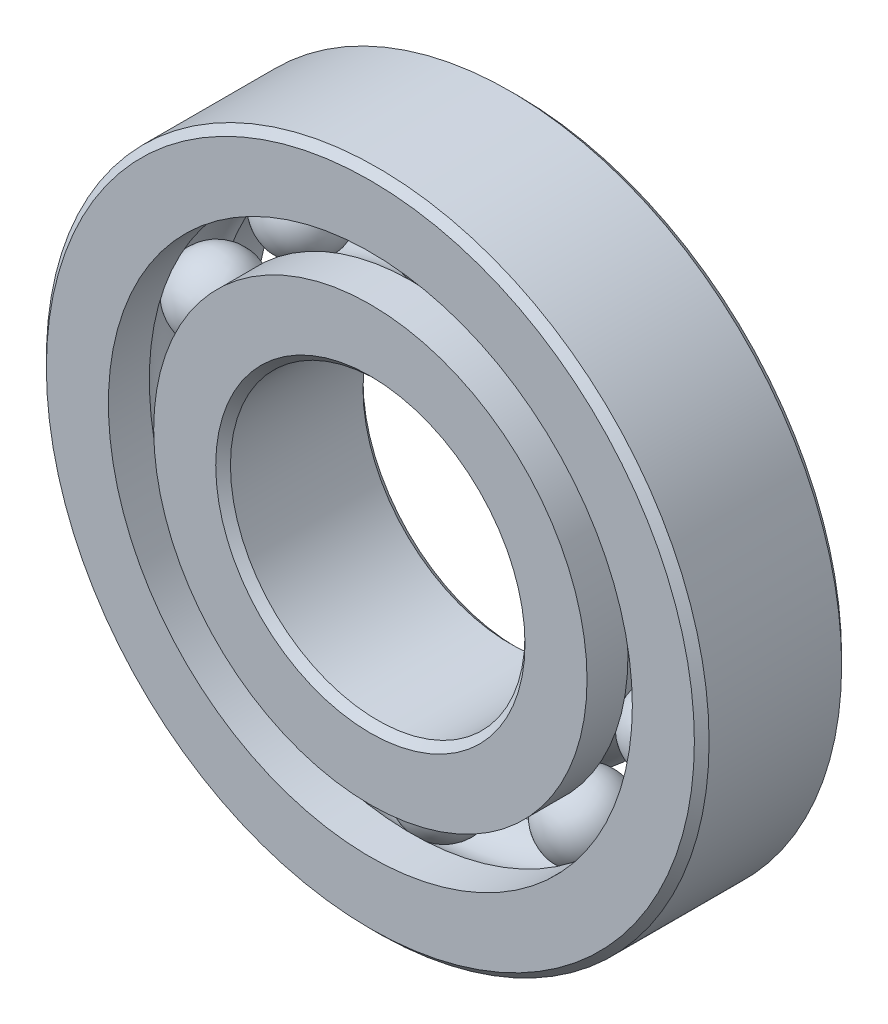
ISO-10303-21;
HEADER;
FILE_DESCRIPTION(('STEP AP214'),'2;1');
FILE_NAME('part.step','',(''),(''),'','','');
FILE_SCHEMA(('AUTOMOTIVE_DESIGN { 1 0 10303 214 1 1 1 1 }'));
ENDSEC;
DATA;
#1=APPLICATION_CONTEXT('core data for automotive mechanical design processes');
#2=APPLICATION_PROTOCOL_DEFINITION('international standard','automotive_design',2000,#1);
#3=PRODUCT_CONTEXT('',#1,'mechanical');
#4=PRODUCT('Part','Part','',(#3));
#5=PRODUCT_RELATED_PRODUCT_CATEGORY('part','',(#4));
#6=PRODUCT_DEFINITION_FORMATION('','',#4);
#7=PRODUCT_DEFINITION_CONTEXT('part definition',#1,'design');
#8=PRODUCT_DEFINITION('design','',#6,#7);
#9=PRODUCT_DEFINITION_SHAPE('','',#8);
#10=(LENGTH_UNIT() NAMED_UNIT(*) SI_UNIT(.MILLI.,.METRE.));
#11=(NAMED_UNIT(*) PLANE_ANGLE_UNIT() SI_UNIT($,.RADIAN.));
#12=(NAMED_UNIT(*) SI_UNIT($,.STERADIAN.) SOLID_ANGLE_UNIT());
#13=UNCERTAINTY_MEASURE_WITH_UNIT(LENGTH_MEASURE(1.E-05),#10,'distance_accuracy_value','');
#14=(GEOMETRIC_REPRESENTATION_CONTEXT(3) GLOBAL_UNCERTAINTY_ASSIGNED_CONTEXT((#13)) GLOBAL_UNIT_ASSIGNED_CONTEXT((#10,
#11,#12)) REPRESENTATION_CONTEXT('',''));
#15=CARTESIAN_POINT('',(0.,0.,0.));
#16=DIRECTION('',(0.,0.,1.));
#17=DIRECTION('',(1.,0.,0.));
#18=AXIS2_PLACEMENT_3D('',#15,#16,#17);
#19=CARTESIAN_POINT('',(-6.06520907209285,8.34804411070657,0.));
#20=DIRECTION('',(0.,0.,1.));
#21=DIRECTION('',(-0.587785252292462,0.809016994374955,0.));
#22=AXIS2_PLACEMENT_3D('',#19,#20,#21);
#23=SPHERICAL_SURFACE('',#22,1.71627890103156);
#24=CARTESIAN_POINT('',(-6.06520907209285,8.34804411070657,1.71627890103156));
#25=VERTEX_POINT('',#24);
#26=VERTEX_LOOP('',#25);
#27=FACE_BOUND('',#26,.T.);
#28=ADVANCED_FACE('F39',(#27),#23,.T.);
#29=CLOSED_SHELL('',(#28));
#30=MANIFOLD_SOLID_BREP('B2',#29);
#31=CARTESIAN_POINT('',(-9.81371442752058,3.1886691107066,0.));
#32=DIRECTION('',(0.,0.,1.));
#33=DIRECTION('',(-0.95105651629515,0.309016994374958,0.));
#34=AXIS2_PLACEMENT_3D('',#31,#32,#33);
#35=SPHERICAL_SURFACE('',#34,1.71627890103156);
#36=CARTESIAN_POINT('',(-9.81371442752058,3.1886691107066,1.71627890103156));
#37=VERTEX_POINT('',#36);
#38=VERTEX_LOOP('',#37);
#39=FACE_BOUND('',#38,.T.);
#40=ADVANCED_FACE('F59',(#39),#35,.T.);
#41=CLOSED_SHELL('',(#40));
#42=MANIFOLD_SOLID_BREP('B6',#41);
#43=CARTESIAN_POINT('',(-9.81371442752065,-3.18866911070639,0.));
#44=DIRECTION('',(0.,0.,1.));
#45=DIRECTION('',(-0.951056516295157,-0.309016994374938,0.));
#46=AXIS2_PLACEMENT_3D('',#43,#44,#45);
#47=SPHERICAL_SURFACE('',#46,1.71627890103156);
#48=CARTESIAN_POINT('',(-9.81371442752065,-3.18866911070639,1.71627890103156));
#49=VERTEX_POINT('',#48);
#50=VERTEX_LOOP('',#49);
#51=FACE_BOUND('',#50,.T.);
#52=ADVANCED_FACE('F79',(#51),#47,.T.);
#53=CLOSED_SHELL('',(#52));
#54=MANIFOLD_SOLID_BREP('B35',#53);
#55=CARTESIAN_POINT('',(-6.06520907209303,-8.34804411070643,0.));
#56=DIRECTION('',(0.,0.,1.));
#57=DIRECTION('',(-0.58778525229248,-0.809016994374942,0.));
#58=AXIS2_PLACEMENT_3D('',#55,#56,#57);
#59=SPHERICAL_SURFACE('',#58,1.71627890103156);
#60=CARTESIAN_POINT('',(-6.06520907209303,-8.34804411070643,1.71627890103156));
#61=VERTEX_POINT('',#60);
#62=VERTEX_LOOP('',#61);
#63=FACE_BOUND('',#62,.T.);
#64=ADVANCED_FACE('F99',(#63),#59,.T.);
#65=CLOSED_SHELL('',(#64));
#66=MANIFOLD_SOLID_BREP('B55',#65);
#67=CARTESIAN_POINT('',(0.,-10.31875,0.));
#68=DIRECTION('',(0.,0.,1.));
#69=DIRECTION('',(0.,-1.,0.));
#70=AXIS2_PLACEMENT_3D('',#67,#68,#69);
#71=SPHERICAL_SURFACE('',#70,1.71627890103156);
#72=CARTESIAN_POINT('',(0.,-10.31875,1.71627890103156));
#73=VERTEX_POINT('',#72);
#74=VERTEX_LOOP('',#73);
#75=FACE_BOUND('',#74,.T.);
#76=ADVANCED_FACE('F119',(#75),#71,.T.);
#77=CLOSED_SHELL('',(#76));
#78=MANIFOLD_SOLID_BREP('B75',#77);
#79=CARTESIAN_POINT('',(6.06520907209291,-8.34804411070652,0.));
#80=DIRECTION('',(0.,0.,1.));
#81=DIRECTION('',(0.587785252292469,-0.809016994374951,0.));
#82=AXIS2_PLACEMENT_3D('',#79,#80,#81);
#83=SPHERICAL_SURFACE('',#82,1.71627890103156);
#84=CARTESIAN_POINT('',(6.06520907209291,-8.34804411070652,1.71627890103156));
#85=VERTEX_POINT('',#84);
#86=VERTEX_LOOP('',#85);
#87=FACE_BOUND('',#86,.T.);
#88=ADVANCED_FACE('F139',(#87),#83,.T.);
#89=CLOSED_SHELL('',(#88));
#90=MANIFOLD_SOLID_BREP('B95',#89);
#91=CARTESIAN_POINT('',(9.8137144275206,-3.18866911070653,0.));
#92=DIRECTION('',(0.,0.,1.));
#93=DIRECTION('',(0.951056516295152,-0.309016994374952,0.));
#94=AXIS2_PLACEMENT_3D('',#91,#92,#93);
#95=SPHERICAL_SURFACE('',#94,1.71627890103156);
#96=CARTESIAN_POINT('',(9.8137144275206,-3.18866911070653,1.71627890103156));
#97=VERTEX_POINT('',#96);
#98=VERTEX_LOOP('',#97);
#99=FACE_BOUND('',#98,.T.);
#100=ADVANCED_FACE('F159',(#99),#95,.T.);
#101=CLOSED_SHELL('',(#100));
#102=MANIFOLD_SOLID_BREP('B115',#101);
#103=CARTESIAN_POINT('',(9.81371442752063,3.18866911070646,0.));
#104=DIRECTION('',(0.,0.,1.));
#105=DIRECTION('',(0.951056516295155,0.309016994374945,0.));
#106=AXIS2_PLACEMENT_3D('',#103,#104,#105);
#107=SPHERICAL_SURFACE('',#106,1.71627890103156);
#108=CARTESIAN_POINT('',(9.81371442752063,3.18866911070646,1.71627890103156));
#109=VERTEX_POINT('',#108);
#110=VERTEX_LOOP('',#109);
#111=FACE_BOUND('',#110,.T.);
#112=ADVANCED_FACE('F179',(#111),#107,.T.);
#113=CLOSED_SHELL('',(#112));
#114=MANIFOLD_SOLID_BREP('B135',#113);
#115=CARTESIAN_POINT('',(6.06520907209297,8.34804411070648,0.));
#116=DIRECTION('',(0.,0.,1.));
#117=DIRECTION('',(0.587785252292474,0.809016994374947,0.));
#118=AXIS2_PLACEMENT_3D('',#115,#116,#117);
#119=SPHERICAL_SURFACE('',#118,1.71627890103156);
#120=CARTESIAN_POINT('',(6.06520907209297,8.34804411070648,1.71627890103156));
#121=VERTEX_POINT('',#120);
#122=VERTEX_LOOP('',#121);
#123=FACE_BOUND('',#122,.T.);
#124=ADVANCED_FACE('F199',(#123),#119,.T.);
#125=CLOSED_SHELL('',(#124));
#126=MANIFOLD_SOLID_BREP('B155',#125);
#127=CARTESIAN_POINT('',(0.,10.31875,0.));
#128=DIRECTION('',(0.,0.,1.));
#129=DIRECTION('',(0.,1.,0.));
#130=AXIS2_PLACEMENT_3D('',#127,#128,#129);
#131=SPHERICAL_SURFACE('',#130,1.71627890103156);
#132=CARTESIAN_POINT('',(0.,10.31875,1.71627890103156));
#133=VERTEX_POINT('',#132);
#134=VERTEX_LOOP('',#133);
#135=FACE_BOUND('',#134,.T.);
#136=ADVANCED_FACE('F221',(#135),#131,.T.);
#137=CLOSED_SHELL('',(#136));
#138=MANIFOLD_SOLID_BREP('B175',#137);
#139=CARTESIAN_POINT('',(0.,9.34182692307692,3.175));
#140=DIRECTION('',(0.,0.,-1.));
#141=DIRECTION('',(-1.,0.,0.));
#142=AXIS2_PLACEMENT_3D('',#139,#140,#141);
#143=PLANE('',#142);
#144=CARTESIAN_POINT('',(0.,0.,3.175));
#145=DIRECTION('',(0.,0.,1.));
#146=DIRECTION('',(1.,0.,0.));
#147=AXIS2_PLACEMENT_3D('',#144,#145,#146);
#148=CIRCLE('',#147,6.6675);
#149=CARTESIAN_POINT('',(6.6675,0.,3.175));
#150=VERTEX_POINT('',#149);
#151=EDGE_CURVE('E268',#150,#150,#148,.T.);
#152=ORIENTED_EDGE('',*,*,#151,.F.);
#153=EDGE_LOOP('',(#152));
#154=FACE_BOUND('',#153,.T.);
#155=CARTESIAN_POINT('',(0.,0.,3.175));
#156=DIRECTION('',(0.,0.,1.));
#157=DIRECTION('',(1.,0.,0.));
#158=AXIS2_PLACEMENT_3D('',#155,#156,#157);
#159=CIRCLE('',#158,9.34182692307692);
#160=CARTESIAN_POINT('',(9.34182692307692,0.,3.175));
#161=VERTEX_POINT('',#160);
#162=EDGE_CURVE('E220',#161,#161,#159,.T.);
#163=ORIENTED_EDGE('',*,*,#162,.T.);
#164=EDGE_LOOP('',(#163));
#165=FACE_BOUND('',#164,.T.);
#166=ADVANCED_FACE('F240',(#154,#165),#143,.F.);
#167=CARTESIAN_POINT('',(0.,0.,3.175));
#168=DIRECTION('',(0.,0.,1.));
#169=DIRECTION('',(1.,0.,0.));
#170=AXIS2_PLACEMENT_3D('',#167,#168,#169);
#171=CYLINDRICAL_SURFACE('',#170,9.34182692307692);
#172=ORIENTED_EDGE('',*,*,#162,.F.);
#173=EDGE_LOOP('',(#172));
#174=FACE_BOUND('',#173,.T.);
#175=CARTESIAN_POINT('',(0.,0.,1.41111111111111));
#176=DIRECTION('',(0.,0.,1.));
#177=DIRECTION('',(1.,0.,0.));
#178=AXIS2_PLACEMENT_3D('',#175,#176,#177);
#179=CIRCLE('',#178,9.34182692307692);
#180=CARTESIAN_POINT('',(9.34182692307692,0.,1.41111111111111));
#181=VERTEX_POINT('',#180);
#182=EDGE_CURVE('E246',#181,#181,#179,.T.);
#183=ORIENTED_EDGE('',*,*,#182,.T.);
#184=EDGE_LOOP('',(#183));
#185=FACE_BOUND('',#184,.T.);
#186=ADVANCED_FACE('F275',(#174,#185),#171,.T.);
#187=CARTESIAN_POINT('',(0.,0.,0.));
#188=DIRECTION('',(0.,0.,1.));
#189=DIRECTION('',(1.,0.,0.));
#190=AXIS2_PLACEMENT_3D('',#187,#188,#189);
#191=TOROIDAL_SURFACE('',#190,10.31875,1.71627890103155);
#192=ORIENTED_EDGE('',*,*,#182,.F.);
#193=EDGE_LOOP('',(#192));
#194=FACE_BOUND('',#193,.T.);
#195=CARTESIAN_POINT('',(0.,0.,-1.41111111111111));
#196=DIRECTION('',(0.,0.,1.));
#197=DIRECTION('',(1.,0.,0.));
#198=AXIS2_PLACEMENT_3D('',#195,#196,#197);
#199=CIRCLE('',#198,9.34182692307692);
#200=CARTESIAN_POINT('',(9.34182692307692,0.,-1.41111111111111));
#201=VERTEX_POINT('',#200);
#202=EDGE_CURVE('E250',#201,#201,#199,.T.);
#203=ORIENTED_EDGE('',*,*,#202,.T.);
#204=EDGE_LOOP('',(#203));
#205=FACE_BOUND('',#204,.T.);
#206=ADVANCED_FACE('F279',(#194,#205),#191,.F.);
#207=CARTESIAN_POINT('',(0.,0.,3.175));
#208=DIRECTION('',(0.,0.,1.));
#209=DIRECTION('',(1.,0.,0.));
#210=AXIS2_PLACEMENT_3D('',#207,#208,#209);
#211=CYLINDRICAL_SURFACE('',#210,9.34182692307692);
#212=ORIENTED_EDGE('',*,*,#202,.F.);
#213=EDGE_LOOP('',(#212));
#214=FACE_BOUND('',#213,.T.);
#215=CARTESIAN_POINT('',(0.,0.,-3.175));
#216=DIRECTION('',(0.,0.,1.));
#217=DIRECTION('',(1.,0.,0.));
#218=AXIS2_PLACEMENT_3D('',#215,#216,#217);
#219=CIRCLE('',#218,9.34182692307692);
#220=CARTESIAN_POINT('',(9.34182692307692,0.,-3.175));
#221=VERTEX_POINT('',#220);
#222=EDGE_CURVE('E254',#221,#221,#219,.T.);
#223=ORIENTED_EDGE('',*,*,#222,.T.);
#224=EDGE_LOOP('',(#223));
#225=FACE_BOUND('',#224,.T.);
#226=ADVANCED_FACE('F284',(#214,#225),#211,.T.);
#227=CARTESIAN_POINT('',(0.,6.6675,-3.175));
#228=DIRECTION('',(0.,0.,1.));
#229=DIRECTION('',(1.,0.,0.));
#230=AXIS2_PLACEMENT_3D('',#227,#228,#229);
#231=PLANE('',#230);
#232=ORIENTED_EDGE('',*,*,#222,.F.);
#233=EDGE_LOOP('',(#232));
#234=FACE_BOUND('',#233,.T.);
#235=CARTESIAN_POINT('',(0.,0.,-3.175));
#236=DIRECTION('',(0.,0.,1.));
#237=DIRECTION('',(1.,0.,0.));
#238=AXIS2_PLACEMENT_3D('',#235,#236,#237);
#239=CIRCLE('',#238,6.6675);
#240=CARTESIAN_POINT('',(6.6675,0.,-3.175));
#241=VERTEX_POINT('',#240);
#242=EDGE_CURVE('E259',#241,#241,#239,.T.);
#243=ORIENTED_EDGE('',*,*,#242,.T.);
#244=EDGE_LOOP('',(#243));
#245=FACE_BOUND('',#244,.T.);
#246=ADVANCED_FACE('F290',(#234,#245),#231,.F.);
#247=CARTESIAN_POINT('',(0.,0.,-2.8575));
#248=DIRECTION('',(0.,0.,-1.));
#249=DIRECTION('',(-1.,0.,0.));
#250=AXIS2_PLACEMENT_3D('',#247,#248,#249);
#251=CONICAL_SURFACE('',#250,6.35,0.785398163397446);
#252=ORIENTED_EDGE('',*,*,#242,.F.);
#253=EDGE_LOOP('',(#252));
#254=FACE_BOUND('',#253,.T.);
#255=CARTESIAN_POINT('',(0.,0.,-2.8575));
#256=DIRECTION('',(0.,0.,1.));
#257=DIRECTION('',(1.,0.,0.));
#258=AXIS2_PLACEMENT_3D('',#255,#256,#257);
#259=CIRCLE('',#258,6.35);
#260=CARTESIAN_POINT('',(6.35,0.,-2.8575));
#261=VERTEX_POINT('',#260);
#262=EDGE_CURVE('E262',#261,#261,#259,.T.);
#263=ORIENTED_EDGE('',*,*,#262,.T.);
#264=EDGE_LOOP('',(#263));
#265=FACE_BOUND('',#264,.T.);
#266=ADVANCED_FACE('F294',(#254,#265),#251,.F.);
#267=CARTESIAN_POINT('',(0.,0.,3.175));
#268=DIRECTION('',(0.,0.,1.));
#269=DIRECTION('',(1.,0.,0.));
#270=AXIS2_PLACEMENT_3D('',#267,#268,#269);
#271=CYLINDRICAL_SURFACE('',#270,6.35);
#272=ORIENTED_EDGE('',*,*,#262,.F.);
#273=EDGE_LOOP('',(#272));
#274=FACE_BOUND('',#273,.T.);
#275=CARTESIAN_POINT('',(0.,0.,2.8575));
#276=DIRECTION('',(0.,0.,1.));
#277=DIRECTION('',(1.,0.,0.));
#278=AXIS2_PLACEMENT_3D('',#275,#276,#277);
#279=CIRCLE('',#278,6.35);
#280=CARTESIAN_POINT('',(6.35,0.,2.8575));
#281=VERTEX_POINT('',#280);
#282=EDGE_CURVE('E265',#281,#281,#279,.T.);
#283=ORIENTED_EDGE('',*,*,#282,.T.);
#284=EDGE_LOOP('',(#283));
#285=FACE_BOUND('',#284,.T.);
#286=ADVANCED_FACE('F298',(#274,#285),#271,.F.);
#287=CARTESIAN_POINT('',(0.,0.,3.175));
#288=DIRECTION('',(0.,0.,1.));
#289=DIRECTION('',(1.,0.,0.));
#290=AXIS2_PLACEMENT_3D('',#287,#288,#289);
#291=CONICAL_SURFACE('',#290,6.6675,0.785398163397452);
#292=ORIENTED_EDGE('',*,*,#282,.F.);
#293=EDGE_LOOP('',(#292));
#294=FACE_BOUND('',#293,.T.);
#295=ORIENTED_EDGE('',*,*,#151,.T.);
#296=EDGE_LOOP('',(#295));
#297=FACE_BOUND('',#296,.T.);
#298=ADVANCED_FACE('F272',(#294,#297),#291,.F.);
#299=CLOSED_SHELL('',(#166,#186,#206,#226,#246,#266,#286,#298));
#300=MANIFOLD_SOLID_BREP('B195',#299);
#301=CARTESIAN_POINT('',(0.,0.,2.8575));
#302=DIRECTION('',(0.,0.,-1.));
#303=DIRECTION('',(-1.,0.,0.));
#304=AXIS2_PLACEMENT_3D('',#301,#302,#303);
#305=CONICAL_SURFACE('',#304,14.2875,0.785398163397446);
#306=CARTESIAN_POINT('',(0.,0.,3.175));
#307=DIRECTION('',(0.,0.,1.));
#308=DIRECTION('',(1.,0.,0.));
#309=AXIS2_PLACEMENT_3D('',#306,#307,#308);
#310=CIRCLE('',#309,13.97);
#311=CARTESIAN_POINT('',(13.97,0.,3.175));
#312=VERTEX_POINT('',#311);
#313=EDGE_CURVE('E389',#312,#312,#310,.T.);
#314=ORIENTED_EDGE('',*,*,#313,.F.);
#315=EDGE_LOOP('',(#314));
#316=FACE_BOUND('',#315,.T.);
#317=CARTESIAN_POINT('',(0.,0.,2.8575));
#318=DIRECTION('',(0.,0.,1.));
#319=DIRECTION('',(1.,0.,0.));
#320=AXIS2_PLACEMENT_3D('',#317,#318,#319);
#321=CIRCLE('',#320,14.2875);
#322=CARTESIAN_POINT('',(14.2875,0.,2.8575));
#323=VERTEX_POINT('',#322);
#324=EDGE_CURVE('E239',#323,#323,#321,.T.);
#325=ORIENTED_EDGE('',*,*,#324,.T.);
#326=EDGE_LOOP('',(#325));
#327=FACE_BOUND('',#326,.T.);
#328=ADVANCED_FACE('F361',(#316,#327),#305,.T.);
#329=CARTESIAN_POINT('',(0.,0.,3.175));
#330=DIRECTION('',(0.,0.,1.));
#331=DIRECTION('',(1.,0.,0.));
#332=AXIS2_PLACEMENT_3D('',#329,#330,#331);
#333=CYLINDRICAL_SURFACE('',#332,14.2875);
#334=ORIENTED_EDGE('',*,*,#324,.F.);
#335=EDGE_LOOP('',(#334));
#336=FACE_BOUND('',#335,.T.);
#337=CARTESIAN_POINT('',(0.,0.,-2.8575));
#338=DIRECTION('',(0.,0.,1.));
#339=DIRECTION('',(1.,0.,0.));
#340=AXIS2_PLACEMENT_3D('',#337,#338,#339);
#341=CIRCLE('',#340,14.2875);
#342=CARTESIAN_POINT('',(14.2875,0.,-2.8575));
#343=VERTEX_POINT('',#342);
#344=EDGE_CURVE('E367',#343,#343,#341,.T.);
#345=ORIENTED_EDGE('',*,*,#344,.T.);
#346=EDGE_LOOP('',(#345));
#347=FACE_BOUND('',#346,.T.);
#348=ADVANCED_FACE('F396',(#336,#347),#333,.T.);
#349=CARTESIAN_POINT('',(0.,0.,-3.175));
#350=DIRECTION('',(0.,0.,1.));
#351=DIRECTION('',(1.,0.,0.));
#352=AXIS2_PLACEMENT_3D('',#349,#350,#351);
#353=CONICAL_SURFACE('',#352,13.97,0.785398163397446);
#354=ORIENTED_EDGE('',*,*,#344,.F.);
#355=EDGE_LOOP('',(#354));
#356=FACE_BOUND('',#355,.T.);
#357=CARTESIAN_POINT('',(0.,0.,-3.175));
#358=DIRECTION('',(0.,0.,1.));
#359=DIRECTION('',(1.,0.,0.));
#360=AXIS2_PLACEMENT_3D('',#357,#358,#359);
#361=CIRCLE('',#360,13.97);
#362=CARTESIAN_POINT('',(13.97,0.,-3.175));
#363=VERTEX_POINT('',#362);
#364=EDGE_CURVE('E371',#363,#363,#361,.T.);
#365=ORIENTED_EDGE('',*,*,#364,.T.);
#366=EDGE_LOOP('',(#365));
#367=FACE_BOUND('',#366,.T.);
#368=ADVANCED_FACE('F400',(#356,#367),#353,.T.);
#369=CARTESIAN_POINT('',(0.,13.97,-3.175));
#370=DIRECTION('',(0.,0.,1.));
#371=DIRECTION('',(1.,0.,0.));
#372=AXIS2_PLACEMENT_3D('',#369,#370,#371);
#373=PLANE('',#372);
#374=ORIENTED_EDGE('',*,*,#364,.F.);
#375=EDGE_LOOP('',(#374));
#376=FACE_BOUND('',#375,.T.);
#377=CARTESIAN_POINT('',(0.,0.,-3.175));
#378=DIRECTION('',(0.,0.,1.));
#379=DIRECTION('',(1.,0.,0.));
#380=AXIS2_PLACEMENT_3D('',#377,#378,#379);
#381=CIRCLE('',#380,11.2956730769231);
#382=CARTESIAN_POINT('',(11.2956730769231,0.,-3.175));
#383=VERTEX_POINT('',#382);
#384=EDGE_CURVE('E375',#383,#383,#381,.T.);
#385=ORIENTED_EDGE('',*,*,#384,.T.);
#386=EDGE_LOOP('',(#385));
#387=FACE_BOUND('',#386,.T.);
#388=ADVANCED_FACE('F405',(#376,#387),#373,.F.);
#389=CARTESIAN_POINT('',(0.,0.,3.175));
#390=DIRECTION('',(0.,0.,1.));
#391=DIRECTION('',(1.,0.,0.));
#392=AXIS2_PLACEMENT_3D('',#389,#390,#391);
#393=CYLINDRICAL_SURFACE('',#392,11.2956730769231);
#394=ORIENTED_EDGE('',*,*,#384,.F.);
#395=EDGE_LOOP('',(#394));
#396=FACE_BOUND('',#395,.T.);
#397=CARTESIAN_POINT('',(0.,0.,-1.41111111111111));
#398=DIRECTION('',(0.,0.,1.));
#399=DIRECTION('',(1.,0.,0.));
#400=AXIS2_PLACEMENT_3D('',#397,#398,#399);
#401=CIRCLE('',#400,11.2956730769231);
#402=CARTESIAN_POINT('',(11.2956730769231,0.,-1.41111111111111));
#403=VERTEX_POINT('',#402);
#404=EDGE_CURVE('E380',#403,#403,#401,.T.);
#405=ORIENTED_EDGE('',*,*,#404,.T.);
#406=EDGE_LOOP('',(#405));
#407=FACE_BOUND('',#406,.T.);
#408=ADVANCED_FACE('F411',(#396,#407),#393,.F.);
#409=CARTESIAN_POINT('',(0.,0.,0.));
#410=DIRECTION('',(0.,0.,1.));
#411=DIRECTION('',(1.,0.,0.));
#412=AXIS2_PLACEMENT_3D('',#409,#410,#411);
#413=TOROIDAL_SURFACE('',#412,10.31875,1.71627890103156);
#414=ORIENTED_EDGE('',*,*,#404,.F.);
#415=EDGE_LOOP('',(#414));
#416=FACE_BOUND('',#415,.T.);
#417=CARTESIAN_POINT('',(0.,0.,1.41111111111111));
#418=DIRECTION('',(0.,0.,1.));
#419=DIRECTION('',(1.,0.,0.));
#420=AXIS2_PLACEMENT_3D('',#417,#418,#419);
#421=CIRCLE('',#420,11.2956730769231);
#422=CARTESIAN_POINT('',(11.2956730769231,0.,1.41111111111111));
#423=VERTEX_POINT('',#422);
#424=EDGE_CURVE('E383',#423,#423,#421,.T.);
#425=ORIENTED_EDGE('',*,*,#424,.T.);
#426=EDGE_LOOP('',(#425));
#427=FACE_BOUND('',#426,.T.);
#428=ADVANCED_FACE('F415',(#416,#427),#413,.F.);
#429=CARTESIAN_POINT('',(0.,0.,3.175));
#430=DIRECTION('',(0.,0.,1.));
#431=DIRECTION('',(1.,0.,0.));
#432=AXIS2_PLACEMENT_3D('',#429,#430,#431);
#433=CYLINDRICAL_SURFACE('',#432,11.2956730769231);
#434=ORIENTED_EDGE('',*,*,#424,.F.);
#435=EDGE_LOOP('',(#434));
#436=FACE_BOUND('',#435,.T.);
#437=CARTESIAN_POINT('',(0.,0.,3.175));
#438=DIRECTION('',(0.,0.,1.));
#439=DIRECTION('',(1.,0.,0.));
#440=AXIS2_PLACEMENT_3D('',#437,#438,#439);
#441=CIRCLE('',#440,11.2956730769231);
#442=CARTESIAN_POINT('',(11.2956730769231,0.,3.175));
#443=VERTEX_POINT('',#442);
#444=EDGE_CURVE('E386',#443,#443,#441,.T.);
#445=ORIENTED_EDGE('',*,*,#444,.T.);
#446=EDGE_LOOP('',(#445));
#447=FACE_BOUND('',#446,.T.);
#448=ADVANCED_FACE('F419',(#436,#447),#433,.F.);
#449=CARTESIAN_POINT('',(0.,13.97,3.175));
#450=DIRECTION('',(0.,0.,-1.));
#451=DIRECTION('',(-1.,0.,0.));
#452=AXIS2_PLACEMENT_3D('',#449,#450,#451);
#453=PLANE('',#452);
#454=ORIENTED_EDGE('',*,*,#444,.F.);
#455=EDGE_LOOP('',(#454));
#456=FACE_BOUND('',#455,.T.);
#457=ORIENTED_EDGE('',*,*,#313,.T.);
#458=EDGE_LOOP('',(#457));
#459=FACE_BOUND('',#458,.T.);
#460=ADVANCED_FACE('F393',(#456,#459),#453,.F.);
#461=CLOSED_SHELL('',(#328,#348,#368,#388,#408,#428,#448,#460));
#462=MANIFOLD_SOLID_BREP('B215',#461);
#463=ADVANCED_BREP_SHAPE_REPRESENTATION('',(#18,#30,#42,#54,#66,#78,#90,#102,#114,#126,#138,
#300,#462),#14);
#464=SHAPE_DEFINITION_REPRESENTATION(#9,#463);
ENDSEC;
END-ISO-10303-21;
